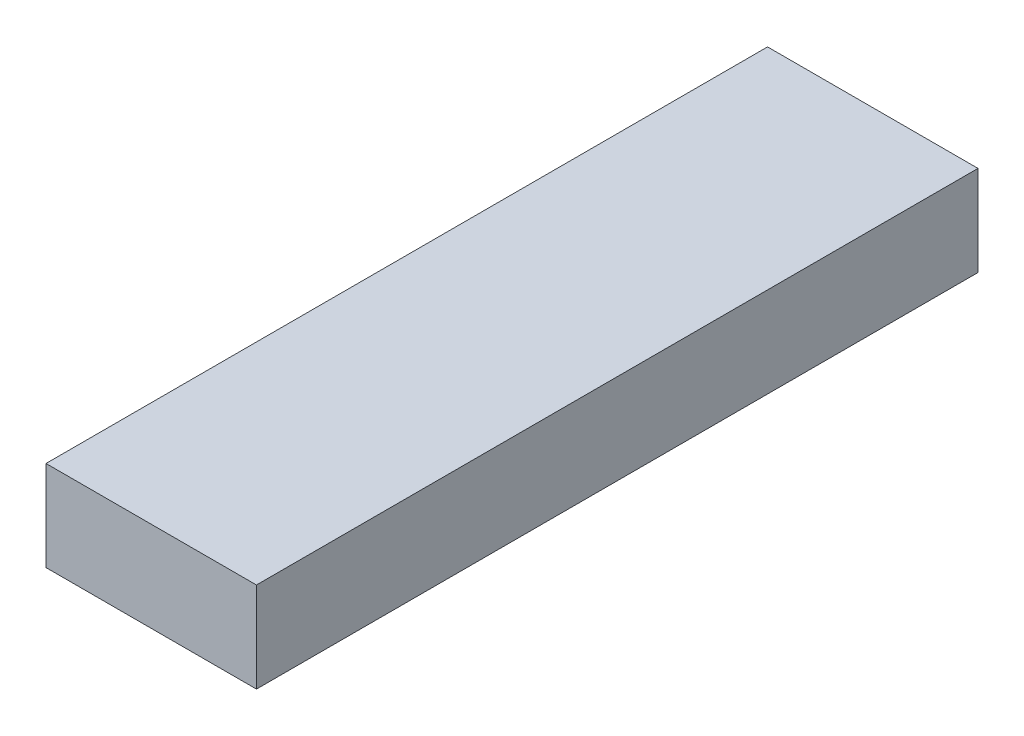
ISO-10303-21;
HEADER;
FILE_DESCRIPTION(('STEP AP214'),'2;1');
FILE_NAME('part.step','',(''),(''),'','','');
FILE_SCHEMA(('AUTOMOTIVE_DESIGN { 1 0 10303 214 1 1 1 1 }'));
ENDSEC;
DATA;
#1=APPLICATION_CONTEXT('core data for automotive mechanical design processes');
#2=APPLICATION_PROTOCOL_DEFINITION('international standard','automotive_design',2000,#1);
#3=PRODUCT_CONTEXT('',#1,'mechanical');
#4=PRODUCT('Part','Part','',(#3));
#5=PRODUCT_RELATED_PRODUCT_CATEGORY('part','',(#4));
#6=PRODUCT_DEFINITION_FORMATION('','',#4);
#7=PRODUCT_DEFINITION_CONTEXT('part definition',#1,'design');
#8=PRODUCT_DEFINITION('design','',#6,#7);
#9=PRODUCT_DEFINITION_SHAPE('','',#8);
#10=(LENGTH_UNIT() NAMED_UNIT(*) SI_UNIT(.MILLI.,.METRE.));
#11=(NAMED_UNIT(*) PLANE_ANGLE_UNIT() SI_UNIT($,.RADIAN.));
#12=(NAMED_UNIT(*) SI_UNIT($,.STERADIAN.) SOLID_ANGLE_UNIT());
#13=UNCERTAINTY_MEASURE_WITH_UNIT(LENGTH_MEASURE(1.E-05),#10,'distance_accuracy_value','');
#14=(GEOMETRIC_REPRESENTATION_CONTEXT(3) GLOBAL_UNCERTAINTY_ASSIGNED_CONTEXT((#13)) GLOBAL_UNIT_ASSIGNED_CONTEXT((#10,
#11,#12)) REPRESENTATION_CONTEXT('',''));
#15=CARTESIAN_POINT('',(0.,0.,0.));
#16=DIRECTION('',(0.,0.,1.));
#17=DIRECTION('',(1.,0.,0.));
#18=AXIS2_PLACEMENT_3D('',#15,#16,#17);
#19=CARTESIAN_POINT('',(44.45,-19.05,152.4));
#20=DIRECTION('',(-1.,0.,0.));
#21=DIRECTION('',(0.,0.,1.));
#22=AXIS2_PLACEMENT_3D('',#19,#20,#21);
#23=PLANE('',#22);
#24=DIRECTION('',(0.,1.,0.));
#25=VECTOR('',#24,1.);
#26=CARTESIAN_POINT('',(44.45,-19.05,-152.4));
#27=LINE('',#26,#25);
#28=CARTESIAN_POINT('',(44.45,-19.05,-152.4));
#29=VERTEX_POINT('',#28);
#30=CARTESIAN_POINT('',(44.45,19.05,-152.4));
#31=VERTEX_POINT('',#30);
#32=EDGE_CURVE('E96',#29,#31,#27,.T.);
#33=ORIENTED_EDGE('',*,*,#32,.T.);
#34=DIRECTION('',(0.,0.,-1.));
#35=VECTOR('',#34,1.);
#36=CARTESIAN_POINT('',(44.45,19.05,152.4));
#37=LINE('',#36,#35);
#38=CARTESIAN_POINT('',(44.45,19.05,152.4));
#39=VERTEX_POINT('',#38);
#40=EDGE_CURVE('E11',#39,#31,#37,.T.);
#41=ORIENTED_EDGE('',*,*,#40,.F.);
#42=DIRECTION('',(0.,1.,0.));
#43=VECTOR('',#42,1.);
#44=CARTESIAN_POINT('',(44.45,-19.05,152.4));
#45=LINE('',#44,#43);
#46=CARTESIAN_POINT('',(44.45,-19.05,152.4));
#47=VERTEX_POINT('',#46);
#48=EDGE_CURVE('E84',#47,#39,#45,.T.);
#49=ORIENTED_EDGE('',*,*,#48,.F.);
#50=DIRECTION('',(0.,0.,-1.));
#51=VECTOR('',#50,1.);
#52=CARTESIAN_POINT('',(44.45,-19.05,152.4));
#53=LINE('',#52,#51);
#54=EDGE_CURVE('E92',#47,#29,#53,.T.);
#55=ORIENTED_EDGE('',*,*,#54,.T.);
#56=EDGE_LOOP('',(#33,#41,#49,#55));
#57=FACE_BOUND('',#56,.T.);
#58=ADVANCED_FACE('F33',(#57),#23,.F.);
#59=CARTESIAN_POINT('',(-44.45,19.05,152.4));
#60=DIRECTION('',(0.,-1.,0.));
#61=DIRECTION('',(0.,0.,-1.));
#62=AXIS2_PLACEMENT_3D('',#59,#60,#61);
#63=PLANE('',#62);
#64=DIRECTION('',(-1.,0.,0.));
#65=VECTOR('',#64,1.);
#66=CARTESIAN_POINT('',(-44.45,19.05,-152.4));
#67=LINE('',#66,#65);
#68=CARTESIAN_POINT('',(-44.45,19.05,-152.4));
#69=VERTEX_POINT('',#68);
#70=EDGE_CURVE('E88',#31,#69,#67,.T.);
#71=ORIENTED_EDGE('',*,*,#70,.T.);
#72=DIRECTION('',(0.,0.,-1.));
#73=VECTOR('',#72,1.);
#74=CARTESIAN_POINT('',(-44.45,19.05,152.4));
#75=LINE('',#74,#73);
#76=CARTESIAN_POINT('',(-44.45,19.05,152.4));
#77=VERTEX_POINT('',#76);
#78=EDGE_CURVE('E41',#77,#69,#75,.T.);
#79=ORIENTED_EDGE('',*,*,#78,.F.);
#80=DIRECTION('',(-1.,0.,0.));
#81=VECTOR('',#80,1.);
#82=CARTESIAN_POINT('',(-44.45,19.05,152.4));
#83=LINE('',#82,#81);
#84=EDGE_CURVE('E79',#39,#77,#83,.T.);
#85=ORIENTED_EDGE('',*,*,#84,.F.);
#86=ORIENTED_EDGE('',*,*,#40,.T.);
#87=EDGE_LOOP('',(#71,#79,#85,#86));
#88=FACE_BOUND('',#87,.T.);
#89=ADVANCED_FACE('F87',(#88),#63,.F.);
#90=CARTESIAN_POINT('',(-44.45,-19.05,152.4));
#91=DIRECTION('',(1.,0.,0.));
#92=DIRECTION('',(0.,0.,-1.));
#93=AXIS2_PLACEMENT_3D('',#90,#91,#92);
#94=PLANE('',#93);
#95=DIRECTION('',(0.,-1.,0.));
#96=VECTOR('',#95,1.);
#97=CARTESIAN_POINT('',(-44.45,-19.05,-152.4));
#98=LINE('',#97,#96);
#99=CARTESIAN_POINT('',(-44.45,-19.05,-152.4));
#100=VERTEX_POINT('',#99);
#101=EDGE_CURVE('E66',#69,#100,#98,.T.);
#102=ORIENTED_EDGE('',*,*,#101,.T.);
#103=DIRECTION('',(0.,0.,-1.));
#104=VECTOR('',#103,1.);
#105=CARTESIAN_POINT('',(-44.45,-19.05,152.4));
#106=LINE('',#105,#104);
#107=CARTESIAN_POINT('',(-44.45,-19.05,152.4));
#108=VERTEX_POINT('',#107);
#109=EDGE_CURVE('E89',#108,#100,#106,.T.);
#110=ORIENTED_EDGE('',*,*,#109,.F.);
#111=DIRECTION('',(0.,-1.,0.));
#112=VECTOR('',#111,1.);
#113=CARTESIAN_POINT('',(-44.45,-19.05,152.4));
#114=LINE('',#113,#112);
#115=EDGE_CURVE('E82',#77,#108,#114,.T.);
#116=ORIENTED_EDGE('',*,*,#115,.F.);
#117=ORIENTED_EDGE('',*,*,#78,.T.);
#118=EDGE_LOOP('',(#102,#110,#116,#117));
#119=FACE_BOUND('',#118,.T.);
#120=ADVANCED_FACE('F90',(#119),#94,.F.);
#121=CARTESIAN_POINT('',(-44.45,-19.05,152.4));
#122=DIRECTION('',(0.,1.,0.));
#123=DIRECTION('',(0.,0.,1.));
#124=AXIS2_PLACEMENT_3D('',#121,#122,#123);
#125=PLANE('',#124);
#126=DIRECTION('',(1.,0.,0.));
#127=VECTOR('',#126,1.);
#128=CARTESIAN_POINT('',(-44.45,-19.05,-152.4));
#129=LINE('',#128,#127);
#130=EDGE_CURVE('E72',#100,#29,#129,.T.);
#131=ORIENTED_EDGE('',*,*,#130,.T.);
#132=ORIENTED_EDGE('',*,*,#54,.F.);
#133=DIRECTION('',(1.,0.,0.));
#134=VECTOR('',#133,1.);
#135=CARTESIAN_POINT('',(-44.45,-19.05,152.4));
#136=LINE('',#135,#134);
#137=EDGE_CURVE('E49',#108,#47,#136,.T.);
#138=ORIENTED_EDGE('',*,*,#137,.F.);
#139=ORIENTED_EDGE('',*,*,#109,.T.);
#140=EDGE_LOOP('',(#131,#132,#138,#139));
#141=FACE_BOUND('',#140,.T.);
#142=ADVANCED_FACE('F103',(#141),#125,.F.);
#143=CARTESIAN_POINT('',(0.,0.,152.4));
#144=DIRECTION('',(0.,0.,-1.));
#145=DIRECTION('',(-1.,0.,0.));
#146=AXIS2_PLACEMENT_3D('',#143,#144,#145);
#147=PLANE('',#146);
#148=ORIENTED_EDGE('',*,*,#48,.T.);
#149=ORIENTED_EDGE('',*,*,#84,.T.);
#150=ORIENTED_EDGE('',*,*,#115,.T.);
#151=ORIENTED_EDGE('',*,*,#137,.T.);
#152=EDGE_LOOP('',(#148,#149,#150,#151));
#153=FACE_BOUND('',#152,.T.);
#154=ADVANCED_FACE('F80',(#153),#147,.F.);
#155=CARTESIAN_POINT('',(0.,0.,-152.4));
#156=DIRECTION('',(0.,0.,-1.));
#157=DIRECTION('',(-1.,0.,0.));
#158=AXIS2_PLACEMENT_3D('',#155,#156,#157);
#159=PLANE('',#158);
#160=ORIENTED_EDGE('',*,*,#32,.F.);
#161=ORIENTED_EDGE('',*,*,#130,.F.);
#162=ORIENTED_EDGE('',*,*,#101,.F.);
#163=ORIENTED_EDGE('',*,*,#70,.F.);
#164=EDGE_LOOP('',(#160,#161,#162,#163));
#165=FACE_BOUND('',#164,.T.);
#166=ADVANCED_FACE('F106',(#165),#159,.T.);
#167=CLOSED_SHELL('',(#58,#89,#120,#142,#154,#166));
#168=MANIFOLD_SOLID_BREP('B2',#167);
#169=ADVANCED_BREP_SHAPE_REPRESENTATION('',(#18,#168),#14);
#170=SHAPE_DEFINITION_REPRESENTATION(#9,#169);
ENDSEC;
END-ISO-10303-21;
